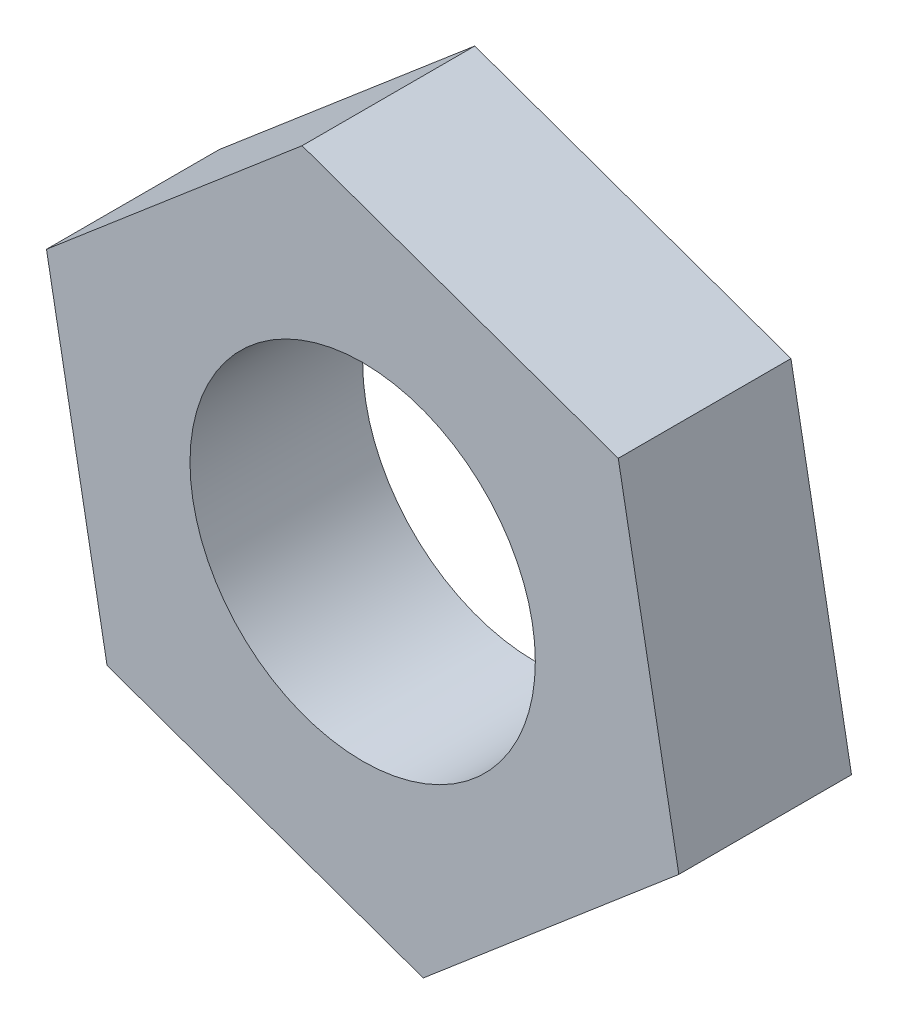
ISO-10303-21;
HEADER;
FILE_DESCRIPTION(('STEP AP214'),'2;1');
FILE_NAME('part.step','',(''),(''),'','','');
FILE_SCHEMA(('AUTOMOTIVE_DESIGN { 1 0 10303 214 1 1 1 1 }'));
ENDSEC;
DATA;
#1=APPLICATION_CONTEXT('core data for automotive mechanical design processes');
#2=APPLICATION_PROTOCOL_DEFINITION('international standard','automotive_design',2000,#1);
#3=PRODUCT_CONTEXT('',#1,'mechanical');
#4=PRODUCT('Part','Part','',(#3));
#5=PRODUCT_RELATED_PRODUCT_CATEGORY('part','',(#4));
#6=PRODUCT_DEFINITION_FORMATION('','',#4);
#7=PRODUCT_DEFINITION_CONTEXT('part definition',#1,'design');
#8=PRODUCT_DEFINITION('design','',#6,#7);
#9=PRODUCT_DEFINITION_SHAPE('','',#8);
#10=(LENGTH_UNIT() NAMED_UNIT(*) SI_UNIT(.MILLI.,.METRE.));
#11=(NAMED_UNIT(*) PLANE_ANGLE_UNIT() SI_UNIT($,.RADIAN.));
#12=(NAMED_UNIT(*) SI_UNIT($,.STERADIAN.) SOLID_ANGLE_UNIT());
#13=UNCERTAINTY_MEASURE_WITH_UNIT(LENGTH_MEASURE(1.E-05),#10,'distance_accuracy_value','');
#14=(GEOMETRIC_REPRESENTATION_CONTEXT(3) GLOBAL_UNCERTAINTY_ASSIGNED_CONTEXT((#13)) GLOBAL_UNIT_ASSIGNED_CONTEXT((#10,
#11,#12)) REPRESENTATION_CONTEXT('',''));
#15=CARTESIAN_POINT('',(0.,0.,0.));
#16=DIRECTION('',(0.,0.,1.));
#17=DIRECTION('',(1.,0.,0.));
#18=AXIS2_PLACEMENT_3D('',#15,#16,#17);
#19=CARTESIAN_POINT('',(985.210087969981,180.720883856329,-3.));
#20=DIRECTION('',(0.98358901573231,0.180423524327469,0.));
#21=DIRECTION('',(-0.180423524327469,0.98358901573231,0.));
#22=AXIS2_PLACEMENT_3D('',#19,#20,#21);
#23=PLANE('',#22);
#24=DIRECTION('',(-0.180423524327469,0.98358901573231,0.));
#25=VECTOR('',#24,1.);
#26=CARTESIAN_POINT('',(985.210087969981,180.720883856329,0.));
#27=LINE('',#26,#25);
#28=CARTESIAN_POINT('',(1328.94014214927,-1693.14288711284,0.));
#29=VERTEX_POINT('',#28);
#30=CARTESIAN_POINT('',(1327.88805220212,-1687.40735944571,0.));
#31=VERTEX_POINT('',#30);
#32=EDGE_CURVE('E137',#29,#31,#27,.T.);
#33=ORIENTED_EDGE('',*,*,#32,.F.);
#34=DIRECTION('',(0.,0.,1.));
#35=VECTOR('',#34,1.);
#36=CARTESIAN_POINT('',(1328.94014214927,-1693.14288711284,-3.));
#37=LINE('',#36,#35);
#38=CARTESIAN_POINT('',(1328.94014214927,-1693.14288711284,-3.));
#39=VERTEX_POINT('',#38);
#40=EDGE_CURVE('E11',#39,#29,#37,.T.);
#41=ORIENTED_EDGE('',*,*,#40,.F.);
#42=DIRECTION('',(-0.180423524327469,0.98358901573231,0.));
#43=VECTOR('',#42,1.);
#44=CARTESIAN_POINT('',(985.210087969981,180.720883856329,-3.));
#45=LINE('',#44,#43);
#46=CARTESIAN_POINT('',(1327.88805220212,-1687.40735944571,-3.));
#47=VERTEX_POINT('',#46);
#48=EDGE_CURVE('E161',#39,#47,#45,.T.);
#49=ORIENTED_EDGE('',*,*,#48,.T.);
#50=DIRECTION('',(0.,0.,1.));
#51=VECTOR('',#50,1.);
#52=CARTESIAN_POINT('',(1327.88805220212,-1687.40735944571,-3.));
#53=LINE('',#52,#51);
#54=EDGE_CURVE('E44',#47,#31,#53,.T.);
#55=ORIENTED_EDGE('',*,*,#54,.T.);
#56=EDGE_LOOP('',(#33,#41,#49,#55));
#57=FACE_BOUND('',#56,.T.);
#58=ADVANCED_FACE('F41',(#57),#23,.T.);
#59=CARTESIAN_POINT('',(1393.76131527928,-1637.98660990438,-3.));
#60=DIRECTION('',(0.64804586337408,-0.761601312343764,0.));
#61=DIRECTION('',(0.761601312343764,0.64804586337408,0.));
#62=AXIS2_PLACEMENT_3D('',#59,#60,#61);
#63=PLANE('',#62);
#64=DIRECTION('',(0.761601312343764,0.64804586337408,0.));
#65=VECTOR('',#64,1.);
#66=CARTESIAN_POINT('',(1393.76131527928,-1637.98660990438,0.));
#67=LINE('',#66,#65);
#68=CARTESIAN_POINT('',(1324.499074459,-1696.9217875677,0.));
#69=VERTEX_POINT('',#68);
#70=EDGE_CURVE('E154',#69,#29,#67,.T.);
#71=ORIENTED_EDGE('',*,*,#70,.F.);
#72=DIRECTION('',(0.,0.,1.));
#73=VECTOR('',#72,1.);
#74=CARTESIAN_POINT('',(1324.499074459,-1696.9217875677,-3.));
#75=LINE('',#74,#73);
#76=CARTESIAN_POINT('',(1324.499074459,-1696.9217875677,-3.));
#77=VERTEX_POINT('',#76);
#78=EDGE_CURVE('E51',#77,#69,#75,.T.);
#79=ORIENTED_EDGE('',*,*,#78,.F.);
#80=DIRECTION('',(0.761601312343764,0.64804586337408,0.));
#81=VECTOR('',#80,1.);
#82=CARTESIAN_POINT('',(1393.76131527928,-1637.98660990438,-3.));
#83=LINE('',#82,#81);
#84=EDGE_CURVE('E119',#77,#39,#83,.T.);
#85=ORIENTED_EDGE('',*,*,#84,.T.);
#86=ORIENTED_EDGE('',*,*,#40,.T.);
#87=EDGE_LOOP('',(#71,#79,#85,#86));
#88=FACE_BOUND('',#87,.T.);
#89=ADVANCED_FACE('F174',(#88),#63,.T.);
#90=CARTESIAN_POINT('',(-387.25567889687,-1087.20581868221,-3.));
#91=DIRECTION('',(-0.335543152358231,-0.942024836671253,0.));
#92=DIRECTION('',(0.942024836671253,-0.335543152358231,0.));
#93=AXIS2_PLACEMENT_3D('',#90,#91,#92);
#94=PLANE('',#93);
#95=DIRECTION('',(0.942024836671253,-0.335543152358231,0.));
#96=VECTOR('',#95,1.);
#97=CARTESIAN_POINT('',(-387.25567889687,-1087.20581868221,0.));
#98=LINE('',#97,#96);
#99=CARTESIAN_POINT('',(1319.00591682158,-1694.96516035544,0.));
#100=VERTEX_POINT('',#99);
#101=EDGE_CURVE('E104',#100,#69,#98,.T.);
#102=ORIENTED_EDGE('',*,*,#101,.F.);
#103=DIRECTION('',(0.,0.,1.));
#104=VECTOR('',#103,1.);
#105=CARTESIAN_POINT('',(1319.00591682158,-1694.96516035544,-3.));
#106=LINE('',#105,#104);
#107=CARTESIAN_POINT('',(1319.00591682158,-1694.96516035544,-3.));
#108=VERTEX_POINT('',#107);
#109=EDGE_CURVE('E99',#108,#100,#106,.T.);
#110=ORIENTED_EDGE('',*,*,#109,.F.);
#111=DIRECTION('',(0.942024836671253,-0.335543152358231,0.));
#112=VECTOR('',#111,1.);
#113=CARTESIAN_POINT('',(-387.25567889687,-1087.20581868221,-3.));
#114=LINE('',#113,#112);
#115=EDGE_CURVE('E102',#108,#77,#114,.T.);
#116=ORIENTED_EDGE('',*,*,#115,.T.);
#117=ORIENTED_EDGE('',*,*,#78,.T.);
#118=EDGE_LOOP('',(#102,#110,#116,#117));
#119=FACE_BOUND('',#118,.T.);
#120=ADVANCED_FACE('F101',(#119),#94,.T.);
#121=CARTESIAN_POINT('',(975.275862642235,178.898610613746,-3.));
#122=DIRECTION('',(-0.983589015732305,-0.180423524327497,0.));
#123=DIRECTION('',(0.180423524327497,-0.983589015732306,0.));
#124=AXIS2_PLACEMENT_3D('',#121,#122,#123);
#125=PLANE('',#124);
#126=DIRECTION('',(0.180423524327497,-0.983589015732305,0.));
#127=VECTOR('',#126,1.);
#128=CARTESIAN_POINT('',(975.275862642235,178.898610613746,0.));
#129=LINE('',#128,#127);
#130=CARTESIAN_POINT('',(1317.95382687443,-1689.22963268831,0.));
#131=VERTEX_POINT('',#130);
#132=EDGE_CURVE('E149',#131,#100,#129,.T.);
#133=ORIENTED_EDGE('',*,*,#132,.F.);
#134=DIRECTION('',(0.,0.,1.));
#135=VECTOR('',#134,1.);
#136=CARTESIAN_POINT('',(1317.95382687443,-1689.22963268831,-3.));
#137=LINE('',#136,#135);
#138=CARTESIAN_POINT('',(1317.95382687443,-1689.22963268831,-3.));
#139=VERTEX_POINT('',#138);
#140=EDGE_CURVE('E110',#139,#131,#137,.T.);
#141=ORIENTED_EDGE('',*,*,#140,.F.);
#142=DIRECTION('',(0.180423524327497,-0.983589015732305,0.));
#143=VECTOR('',#142,1.);
#144=CARTESIAN_POINT('',(975.275862642235,178.898610613746,-3.));
#145=LINE('',#144,#143);
#146=EDGE_CURVE('E117',#139,#108,#145,.T.);
#147=ORIENTED_EDGE('',*,*,#146,.T.);
#148=ORIENTED_EDGE('',*,*,#109,.T.);
#149=EDGE_LOOP('',(#133,#141,#147,#148));
#150=FACE_BOUND('',#149,.T.);
#151=ADVANCED_FACE('F122',(#150),#125,.T.);
#152=CARTESIAN_POINT('',(1387.21606769476,-1630.29445502493,-3.));
#153=DIRECTION('',(-0.648045863374108,0.76160131234374,0.));
#154=DIRECTION('',(-0.76160131234374,-0.648045863374108,0.));
#155=AXIS2_PLACEMENT_3D('',#152,#153,#154);
#156=PLANE('',#155);
#157=DIRECTION('',(-0.76160131234374,-0.648045863374109,0.));
#158=VECTOR('',#157,1.);
#159=CARTESIAN_POINT('',(1387.21606769476,-1630.29445502493,0.));
#160=LINE('',#159,#158);
#161=CARTESIAN_POINT('',(1322.3948945647,-1685.45073223344,0.));
#162=VERTEX_POINT('',#161);
#163=EDGE_CURVE('E145',#162,#131,#160,.T.);
#164=ORIENTED_EDGE('',*,*,#163,.F.);
#165=DIRECTION('',(0.,0.,1.));
#166=VECTOR('',#165,1.);
#167=CARTESIAN_POINT('',(1322.3948945647,-1685.45073223344,-3.));
#168=LINE('',#167,#166);
#169=CARTESIAN_POINT('',(1322.3948945647,-1685.45073223344,-3.));
#170=VERTEX_POINT('',#169);
#171=EDGE_CURVE('E166',#170,#162,#168,.T.);
#172=ORIENTED_EDGE('',*,*,#171,.F.);
#173=DIRECTION('',(-0.76160131234374,-0.648045863374109,0.));
#174=VECTOR('',#173,1.);
#175=CARTESIAN_POINT('',(1387.21606769476,-1630.29445502493,-3.));
#176=LINE('',#175,#174);
#177=EDGE_CURVE('E124',#170,#139,#176,.T.);
#178=ORIENTED_EDGE('',*,*,#177,.T.);
#179=ORIENTED_EDGE('',*,*,#140,.T.);
#180=EDGE_LOOP('',(#164,#172,#178,#179));
#181=FACE_BOUND('',#180,.T.);
#182=ADVANCED_FACE('F188',(#181),#156,.T.);
#183=CARTESIAN_POINT('',(-383.86670115375,-1077.69139056023,-3.));
#184=DIRECTION('',(0.335543152358221,0.942024836671257,0.));
#185=DIRECTION('',(-0.942024836671257,0.335543152358221,0.));
#186=AXIS2_PLACEMENT_3D('',#183,#184,#185);
#187=PLANE('',#186);
#188=DIRECTION('',(-0.942024836671257,0.335543152358221,0.));
#189=VECTOR('',#188,1.);
#190=CARTESIAN_POINT('',(-383.86670115375,-1077.69139056023,0.));
#191=LINE('',#190,#189);
#192=EDGE_CURVE('E141',#31,#162,#191,.T.);
#193=ORIENTED_EDGE('',*,*,#192,.F.);
#194=ORIENTED_EDGE('',*,*,#54,.F.);
#195=DIRECTION('',(-0.942024836671257,0.335543152358221,0.));
#196=VECTOR('',#195,1.);
#197=CARTESIAN_POINT('',(-383.86670115375,-1077.69139056023,-3.));
#198=LINE('',#197,#196);
#199=EDGE_CURVE('E127',#47,#170,#198,.T.);
#200=ORIENTED_EDGE('',*,*,#199,.T.);
#201=ORIENTED_EDGE('',*,*,#171,.T.);
#202=EDGE_LOOP('',(#193,#194,#200,#201));
#203=FACE_BOUND('',#202,.T.);
#204=ADVANCED_FACE('F170',(#203),#187,.T.);
#205=CARTESIAN_POINT('',(1323.44698451185,-1691.18625990057,-3.));
#206=DIRECTION('',(0.,0.,1.));
#207=DIRECTION('',(1.,0.,0.));
#208=AXIS2_PLACEMENT_3D('',#205,#206,#207);
#209=CYLINDRICAL_SURFACE('',#208,2.99999999999994);
#210=CARTESIAN_POINT('',(1323.44698451185,-1691.18625990057,-3.));
#211=DIRECTION('',(0.,0.,1.));
#212=DIRECTION('',(1.,0.,0.));
#213=AXIS2_PLACEMENT_3D('',#210,#211,#212);
#214=CIRCLE('',#213,2.99999999999994);
#215=CARTESIAN_POINT('',(1326.44698451184,-1691.18625990057,-3.));
#216=VERTEX_POINT('',#215);
#217=EDGE_CURVE('E133',#216,#216,#214,.T.);
#218=ORIENTED_EDGE('',*,*,#217,.F.);
#219=EDGE_LOOP('',(#218));
#220=FACE_BOUND('',#219,.T.);
#221=CARTESIAN_POINT('',(1323.44698451185,-1691.18625990057,0.));
#222=DIRECTION('',(0.,0.,1.));
#223=DIRECTION('',(1.,0.,0.));
#224=AXIS2_PLACEMENT_3D('',#221,#222,#223);
#225=CIRCLE('',#224,2.99999999999994);
#226=CARTESIAN_POINT('',(1326.44698451184,-1691.18625990057,0.));
#227=VERTEX_POINT('',#226);
#228=EDGE_CURVE('E158',#227,#227,#225,.T.);
#229=ORIENTED_EDGE('',*,*,#228,.T.);
#230=EDGE_LOOP('',(#229));
#231=FACE_BOUND('',#230,.T.);
#232=ADVANCED_FACE('F183',(#220,#231),#209,.F.);
#233=CARTESIAN_POINT('',(0.,0.,-3.));
#234=DIRECTION('',(0.,0.,1.));
#235=DIRECTION('',(1.,0.,0.));
#236=AXIS2_PLACEMENT_3D('',#233,#234,#235);
#237=PLANE('',#236);
#238=ORIENTED_EDGE('',*,*,#48,.F.);
#239=ORIENTED_EDGE('',*,*,#84,.F.);
#240=ORIENTED_EDGE('',*,*,#115,.F.);
#241=ORIENTED_EDGE('',*,*,#146,.F.);
#242=ORIENTED_EDGE('',*,*,#177,.F.);
#243=ORIENTED_EDGE('',*,*,#199,.F.);
#244=EDGE_LOOP('',(#238,#239,#240,#241,#242,#243));
#245=FACE_BOUND('',#244,.T.);
#246=ORIENTED_EDGE('',*,*,#217,.T.);
#247=EDGE_LOOP('',(#246));
#248=FACE_BOUND('',#247,.T.);
#249=ADVANCED_FACE('F114',(#245,#248),#237,.F.);
#250=CARTESIAN_POINT('',(0.,0.,0.));
#251=DIRECTION('',(0.,0.,1.));
#252=DIRECTION('',(1.,0.,0.));
#253=AXIS2_PLACEMENT_3D('',#250,#251,#252);
#254=PLANE('',#253);
#255=ORIENTED_EDGE('',*,*,#32,.T.);
#256=ORIENTED_EDGE('',*,*,#192,.T.);
#257=ORIENTED_EDGE('',*,*,#163,.T.);
#258=ORIENTED_EDGE('',*,*,#132,.T.);
#259=ORIENTED_EDGE('',*,*,#101,.T.);
#260=ORIENTED_EDGE('',*,*,#70,.T.);
#261=EDGE_LOOP('',(#255,#256,#257,#258,#259,#260));
#262=FACE_BOUND('',#261,.T.);
#263=ORIENTED_EDGE('',*,*,#228,.F.);
#264=EDGE_LOOP('',(#263));
#265=FACE_BOUND('',#264,.T.);
#266=ADVANCED_FACE('F172',(#262,#265),#254,.T.);
#267=CLOSED_SHELL('',(#58,#89,#120,#151,#182,#204,#232,#249,#266));
#268=MANIFOLD_SOLID_BREP('B2',#267);
#269=ADVANCED_BREP_SHAPE_REPRESENTATION('',(#18,#268),#14);
#270=SHAPE_DEFINITION_REPRESENTATION(#9,#269);
ENDSEC;
END-ISO-10303-21;
